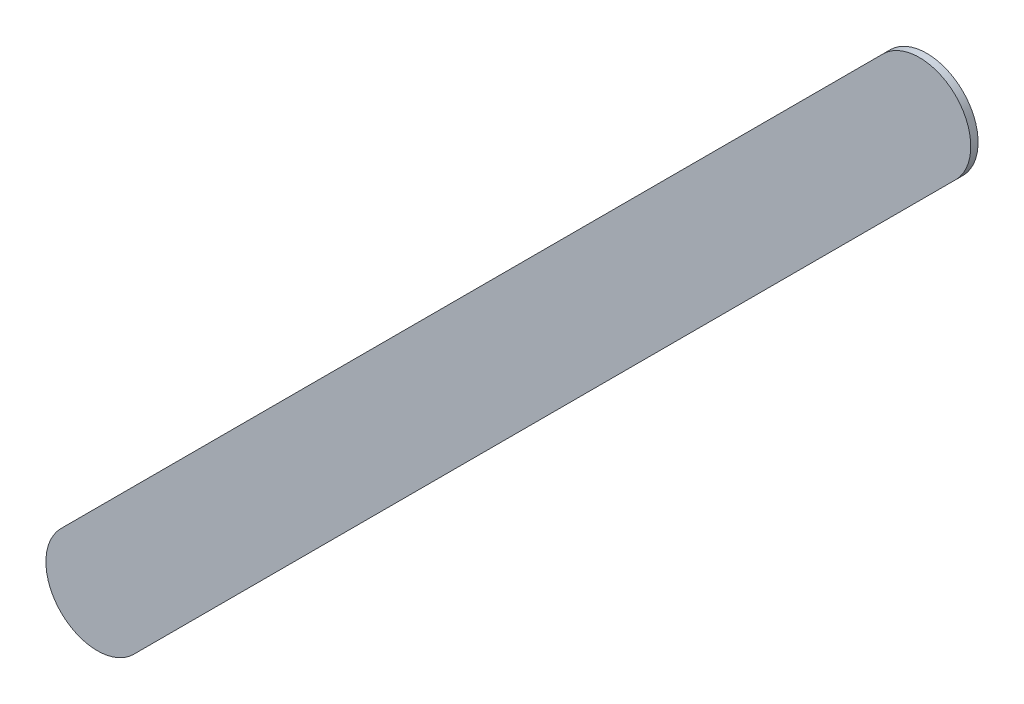
ISO-10303-21;
HEADER;
FILE_DESCRIPTION(('STEP AP214'),'2;1');
FILE_NAME('part.step','',(''),(''),'','','');
FILE_SCHEMA(('AUTOMOTIVE_DESIGN { 1 0 10303 214 1 1 1 1 }'));
ENDSEC;
DATA;
#1=APPLICATION_CONTEXT('core data for automotive mechanical design processes');
#2=APPLICATION_PROTOCOL_DEFINITION('international standard','automotive_design',2000,#1);
#3=PRODUCT_CONTEXT('',#1,'mechanical');
#4=PRODUCT('Part','Part','',(#3));
#5=PRODUCT_RELATED_PRODUCT_CATEGORY('part','',(#4));
#6=PRODUCT_DEFINITION_FORMATION('','',#4);
#7=PRODUCT_DEFINITION_CONTEXT('part definition',#1,'design');
#8=PRODUCT_DEFINITION('design','',#6,#7);
#9=PRODUCT_DEFINITION_SHAPE('','',#8);
#10=(LENGTH_UNIT() NAMED_UNIT(*) SI_UNIT(.MILLI.,.METRE.));
#11=(NAMED_UNIT(*) PLANE_ANGLE_UNIT() SI_UNIT($,.RADIAN.));
#12=(NAMED_UNIT(*) SI_UNIT($,.STERADIAN.) SOLID_ANGLE_UNIT());
#13=UNCERTAINTY_MEASURE_WITH_UNIT(LENGTH_MEASURE(1.E-05),#10,'distance_accuracy_value','');
#14=(GEOMETRIC_REPRESENTATION_CONTEXT(3) GLOBAL_UNCERTAINTY_ASSIGNED_CONTEXT((#13)) GLOBAL_UNIT_ASSIGNED_CONTEXT((#10,
#11,#12)) REPRESENTATION_CONTEXT('',''));
#15=CARTESIAN_POINT('',(0.,0.,0.));
#16=DIRECTION('',(0.,0.,1.));
#17=DIRECTION('',(1.,0.,0.));
#18=AXIS2_PLACEMENT_3D('',#15,#16,#17);
#19=CARTESIAN_POINT('',(48.57678626,55.82323354,0.));
#20=DIRECTION('',(-0.707106781186548,0.707106781186548,0.));
#21=DIRECTION('',(0.707106781186548,0.707106781186548,0.));
#22=AXIS2_PLACEMENT_3D('',#19,#20,#21);
#23=PLANE('',#22);
#24=DIRECTION('',(0.707106781186548,0.707106781186548,0.));
#25=VECTOR('',#24,1.);
#26=CARTESIAN_POINT('',(48.57678626,55.82323354,0.03556));
#27=LINE('',#26,#25);
#28=CARTESIAN_POINT('',(48.57678626,55.82323354,0.03556));
#29=VERTEX_POINT('',#28);
#30=CARTESIAN_POINT('',(52.57677572,59.823223,0.03556));
#31=VERTEX_POINT('',#30);
#32=EDGE_CURVE('E11',#29,#31,#27,.T.);
#33=ORIENTED_EDGE('',*,*,#32,.F.);
#34=DIRECTION('',(0.,0.,1.));
#35=VECTOR('',#34,1.);
#36=CARTESIAN_POINT('',(48.57678626,55.82323354,0.));
#37=LINE('',#36,#35);
#38=CARTESIAN_POINT('',(48.57678626,55.82323354,0.));
#39=VERTEX_POINT('',#38);
#40=EDGE_CURVE('E24',#39,#29,#37,.T.);
#41=ORIENTED_EDGE('',*,*,#40,.F.);
#42=DIRECTION('',(0.707106781186548,0.707106781186548,0.));
#43=VECTOR('',#42,1.);
#44=CARTESIAN_POINT('',(48.57678626,55.82323354,0.));
#45=LINE('',#44,#43);
#46=CARTESIAN_POINT('',(52.57677572,59.823223,0.));
#47=VERTEX_POINT('',#46);
#48=EDGE_CURVE('E75',#39,#47,#45,.T.);
#49=ORIENTED_EDGE('',*,*,#48,.T.);
#50=DIRECTION('',(0.,0.,1.));
#51=VECTOR('',#50,1.);
#52=CARTESIAN_POINT('',(52.57677572,59.823223,0.));
#53=LINE('',#52,#51);
#54=EDGE_CURVE('E37',#47,#31,#53,.T.);
#55=ORIENTED_EDGE('',*,*,#54,.T.);
#56=EDGE_LOOP('',(#33,#41,#49,#55));
#57=FACE_BOUND('',#56,.T.);
#58=ADVANCED_FACE('F17',(#57),#23,.F.);
#59=CARTESIAN_POINT('',(52.39999934,59.99999938,0.));
#60=DIRECTION('',(0.,0.,-1.));
#61=DIRECTION('',(0.707106781186562,-0.707106781186533,0.));
#62=AXIS2_PLACEMENT_3D('',#59,#60,#61);
#63=CYLINDRICAL_SURFACE('',#62,0.249999554103223);
#64=CARTESIAN_POINT('',(52.39999934,59.99999938,0.03556));
#65=DIRECTION('',(0.,0.,1.));
#66=DIRECTION('',(0.707106781186562,-0.707106781186533,0.));
#67=AXIS2_PLACEMENT_3D('',#64,#65,#66);
#68=CIRCLE('',#67,0.249999554103223);
#69=CARTESIAN_POINT('',(52.22322296,60.17677576,0.03556));
#70=VERTEX_POINT('',#69);
#71=EDGE_CURVE('E83',#31,#70,#68,.T.);
#72=ORIENTED_EDGE('',*,*,#71,.F.);
#73=ORIENTED_EDGE('',*,*,#54,.F.);
#74=CARTESIAN_POINT('',(52.39999934,59.99999938,0.));
#75=DIRECTION('',(0.,0.,1.));
#76=DIRECTION('',(0.707106781186562,-0.707106781186533,0.));
#77=AXIS2_PLACEMENT_3D('',#74,#75,#76);
#78=CIRCLE('',#77,0.249999554103223);
#79=CARTESIAN_POINT('',(52.22322296,60.17677576,0.));
#80=VERTEX_POINT('',#79);
#81=EDGE_CURVE('E81',#47,#80,#78,.T.);
#82=ORIENTED_EDGE('',*,*,#81,.T.);
#83=DIRECTION('',(0.,0.,1.));
#84=VECTOR('',#83,1.);
#85=CARTESIAN_POINT('',(52.22322296,60.17677576,0.));
#86=LINE('',#85,#84);
#87=EDGE_CURVE('E67',#80,#70,#86,.T.);
#88=ORIENTED_EDGE('',*,*,#87,.T.);
#89=EDGE_LOOP('',(#72,#73,#82,#88));
#90=FACE_BOUND('',#89,.T.);
#91=ADVANCED_FACE('F89',(#90),#63,.T.);
#92=CARTESIAN_POINT('',(52.22322296,60.17677576,0.));
#93=DIRECTION('',(0.707106781186548,-0.707106781186548,0.));
#94=DIRECTION('',(-0.707106781186548,-0.707106781186548,0.));
#95=AXIS2_PLACEMENT_3D('',#92,#93,#94);
#96=PLANE('',#95);
#97=DIRECTION('',(-0.707106781186548,-0.707106781186548,0.));
#98=VECTOR('',#97,1.);
#99=CARTESIAN_POINT('',(52.22322296,60.17677576,0.03556));
#100=LINE('',#99,#98);
#101=CARTESIAN_POINT('',(48.2232335,56.1767863,0.03556));
#102=VERTEX_POINT('',#101);
#103=EDGE_CURVE('E71',#70,#102,#100,.T.);
#104=ORIENTED_EDGE('',*,*,#103,.F.);
#105=ORIENTED_EDGE('',*,*,#87,.F.);
#106=DIRECTION('',(-0.707106781186548,-0.707106781186548,0.));
#107=VECTOR('',#106,1.);
#108=CARTESIAN_POINT('',(52.22322296,60.17677576,0.));
#109=LINE('',#108,#107);
#110=CARTESIAN_POINT('',(48.2232335,56.1767863,0.));
#111=VERTEX_POINT('',#110);
#112=EDGE_CURVE('E63',#80,#111,#109,.T.);
#113=ORIENTED_EDGE('',*,*,#112,.T.);
#114=DIRECTION('',(0.,0.,1.));
#115=VECTOR('',#114,1.);
#116=CARTESIAN_POINT('',(48.2232335,56.1767863,0.));
#117=LINE('',#116,#115);
#118=EDGE_CURVE('E53',#111,#102,#117,.T.);
#119=ORIENTED_EDGE('',*,*,#118,.T.);
#120=EDGE_LOOP('',(#104,#105,#113,#119));
#121=FACE_BOUND('',#120,.T.);
#122=ADVANCED_FACE('F66',(#121),#96,.F.);
#123=CARTESIAN_POINT('',(48.40000988,56.00000992,0.));
#124=DIRECTION('',(0.,0.,-1.));
#125=DIRECTION('',(-0.707106781186533,0.707106781186562,0.));
#126=AXIS2_PLACEMENT_3D('',#123,#124,#125);
#127=CYLINDRICAL_SURFACE('',#126,0.249999554103221);
#128=CARTESIAN_POINT('',(48.40000988,56.00000992,0.03556));
#129=DIRECTION('',(0.,0.,1.));
#130=DIRECTION('',(-0.707106781186533,0.707106781186562,0.));
#131=AXIS2_PLACEMENT_3D('',#128,#129,#130);
#132=CIRCLE('',#131,0.249999554103221);
#133=EDGE_CURVE('E59',#102,#29,#132,.T.);
#134=ORIENTED_EDGE('',*,*,#133,.F.);
#135=ORIENTED_EDGE('',*,*,#118,.F.);
#136=CARTESIAN_POINT('',(48.40000988,56.00000992,0.));
#137=DIRECTION('',(0.,0.,1.));
#138=DIRECTION('',(-0.707106781186533,0.707106781186562,0.));
#139=AXIS2_PLACEMENT_3D('',#136,#137,#138);
#140=CIRCLE('',#139,0.249999554103221);
#141=EDGE_CURVE('E57',#111,#39,#140,.T.);
#142=ORIENTED_EDGE('',*,*,#141,.T.);
#143=ORIENTED_EDGE('',*,*,#40,.T.);
#144=EDGE_LOOP('',(#134,#135,#142,#143));
#145=FACE_BOUND('',#144,.T.);
#146=ADVANCED_FACE('F55',(#145),#127,.T.);
#147=CARTESIAN_POINT('',(48.57678626,55.82323354,0.));
#148=DIRECTION('',(0.,0.,-1.));
#149=DIRECTION('',(-1.,0.,0.));
#150=AXIS2_PLACEMENT_3D('',#147,#148,#149);
#151=PLANE('',#150);
#152=ORIENTED_EDGE('',*,*,#141,.F.);
#153=ORIENTED_EDGE('',*,*,#112,.F.);
#154=ORIENTED_EDGE('',*,*,#81,.F.);
#155=ORIENTED_EDGE('',*,*,#48,.F.);
#156=EDGE_LOOP('',(#152,#153,#154,#155));
#157=FACE_BOUND('',#156,.T.);
#158=ADVANCED_FACE('F74',(#157),#151,.T.);
#159=CARTESIAN_POINT('',(48.57678626,55.82323354,0.03556));
#160=DIRECTION('',(0.,0.,-1.));
#161=DIRECTION('',(-1.,0.,0.));
#162=AXIS2_PLACEMENT_3D('',#159,#160,#161);
#163=PLANE('',#162);
#164=ORIENTED_EDGE('',*,*,#32,.T.);
#165=ORIENTED_EDGE('',*,*,#71,.T.);
#166=ORIENTED_EDGE('',*,*,#103,.T.);
#167=ORIENTED_EDGE('',*,*,#133,.T.);
#168=EDGE_LOOP('',(#164,#165,#166,#167));
#169=FACE_BOUND('',#168,.T.);
#170=ADVANCED_FACE('F91',(#169),#163,.F.);
#171=CLOSED_SHELL('',(#58,#91,#122,#146,#158,#170));
#172=MANIFOLD_SOLID_BREP('B1',#171);
#173=ADVANCED_BREP_SHAPE_REPRESENTATION('',(#18,#172),#14);
#174=SHAPE_DEFINITION_REPRESENTATION(#9,#173);
ENDSEC;
END-ISO-10303-21;
